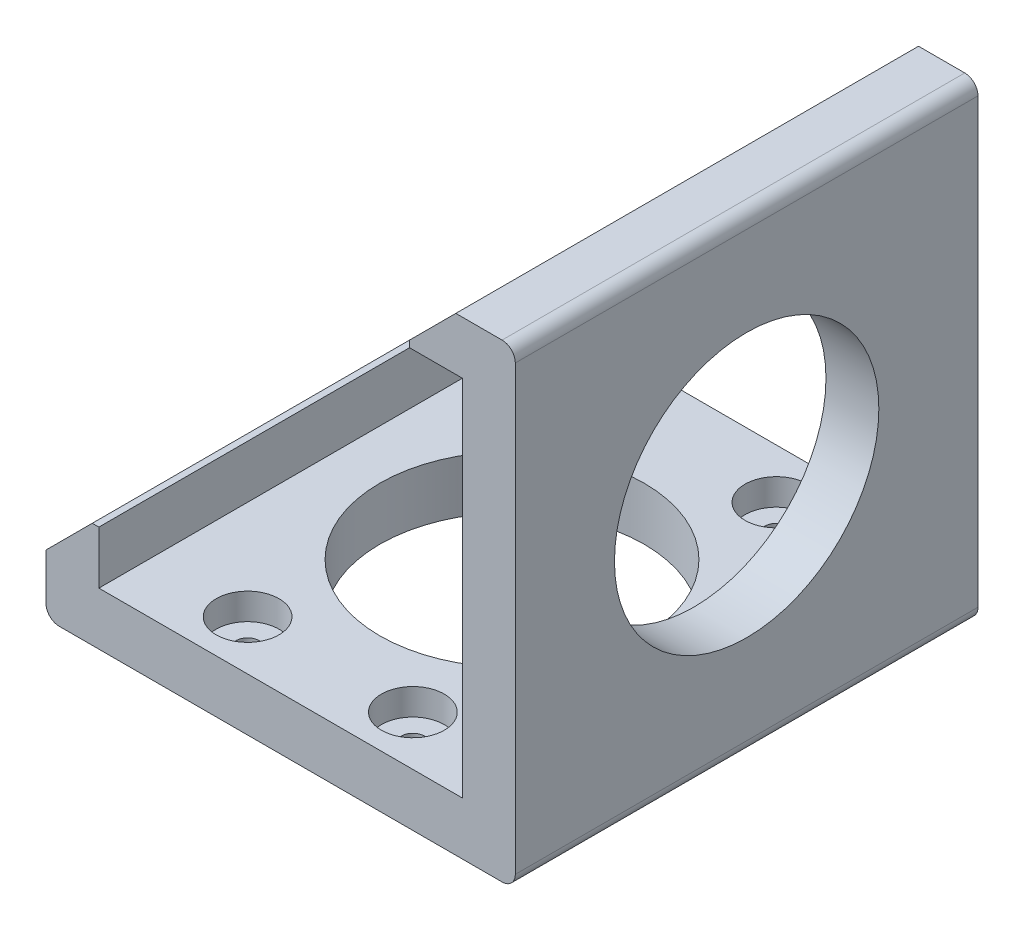
ISO-10303-21;
HEADER;
FILE_DESCRIPTION(('STEP AP214'),'2;1');
FILE_NAME('part.step','',(''),(''),'','','');
FILE_SCHEMA(('AUTOMOTIVE_DESIGN { 1 0 10303 214 1 1 1 1 }'));
ENDSEC;
DATA;
#1=APPLICATION_CONTEXT('core data for automotive mechanical design processes');
#2=APPLICATION_PROTOCOL_DEFINITION('international standard','automotive_design',2000,#1);
#3=PRODUCT_CONTEXT('',#1,'mechanical');
#4=PRODUCT('Part','Part','',(#3));
#5=PRODUCT_RELATED_PRODUCT_CATEGORY('part','',(#4));
#6=PRODUCT_DEFINITION_FORMATION('','',#4);
#7=PRODUCT_DEFINITION_CONTEXT('part definition',#1,'design');
#8=PRODUCT_DEFINITION('design','',#6,#7);
#9=PRODUCT_DEFINITION_SHAPE('','',#8);
#10=(LENGTH_UNIT() NAMED_UNIT(*) SI_UNIT(.MILLI.,.METRE.));
#11=(NAMED_UNIT(*) PLANE_ANGLE_UNIT() SI_UNIT($,.RADIAN.));
#12=(NAMED_UNIT(*) SI_UNIT($,.STERADIAN.) SOLID_ANGLE_UNIT());
#13=UNCERTAINTY_MEASURE_WITH_UNIT(LENGTH_MEASURE(1.E-05),#10,'distance_accuracy_value','');
#14=(GEOMETRIC_REPRESENTATION_CONTEXT(3) GLOBAL_UNCERTAINTY_ASSIGNED_CONTEXT((#13)) GLOBAL_UNIT_ASSIGNED_CONTEXT((#10,
#11,#12)) REPRESENTATION_CONTEXT('',''));
#15=CARTESIAN_POINT('',(0.,0.,0.));
#16=DIRECTION('',(0.,0.,1.));
#17=DIRECTION('',(1.,0.,0.));
#18=AXIS2_PLACEMENT_3D('',#15,#16,#17);
#19=CARTESIAN_POINT('',(-40.,15.,62.5));
#20=DIRECTION('',(0.,-1.,0.));
#21=DIRECTION('',(0.,0.,-1.));
#22=AXIS2_PLACEMENT_3D('',#19,#20,#21);
#23=CYLINDRICAL_SURFACE('',#22,1.75);
#24=CARTESIAN_POINT('',(-40.,-8.,62.5));
#25=DIRECTION('',(0.,-1.,0.));
#26=DIRECTION('',(0.,0.,-1.));
#27=AXIS2_PLACEMENT_3D('',#24,#25,#26);
#28=CIRCLE('',#27,1.75);
#29=CARTESIAN_POINT('',(-40.,-8.,60.75));
#30=VERTEX_POINT('',#29);
#31=EDGE_CURVE('E223',#30,#30,#28,.T.);
#32=ORIENTED_EDGE('',*,*,#31,.T.);
#33=EDGE_LOOP('',(#32));
#34=FACE_BOUND('',#33,.T.);
#35=CARTESIAN_POINT('',(-40.,-4.,62.5));
#36=DIRECTION('',(0.,1.,0.));
#37=DIRECTION('',(0.,0.,1.));
#38=AXIS2_PLACEMENT_3D('',#35,#36,#37);
#39=CIRCLE('',#38,1.75);
#40=CARTESIAN_POINT('',(-40.,-4.,64.25));
#41=VERTEX_POINT('',#40);
#42=EDGE_CURVE('E465',#41,#41,#39,.T.);
#43=ORIENTED_EDGE('',*,*,#42,.T.);
#44=EDGE_LOOP('',(#43));
#45=FACE_BOUND('',#44,.T.);
#46=ADVANCED_FACE('F38',(#34,#45),#23,.F.);
#47=CARTESIAN_POINT('',(-40.,15.,7.50000000000001));
#48=DIRECTION('',(0.,-1.,0.));
#49=DIRECTION('',(0.,0.,-1.));
#50=AXIS2_PLACEMENT_3D('',#47,#48,#49);
#51=CYLINDRICAL_SURFACE('',#50,1.75);
#52=CARTESIAN_POINT('',(-40.,-8.,7.50000000000001));
#53=DIRECTION('',(0.,-1.,0.));
#54=DIRECTION('',(0.,0.,-1.));
#55=AXIS2_PLACEMENT_3D('',#52,#53,#54);
#56=CIRCLE('',#55,1.75);
#57=CARTESIAN_POINT('',(-40.,-8.,5.75000000000001));
#58=VERTEX_POINT('',#57);
#59=EDGE_CURVE('E488',#58,#58,#56,.T.);
#60=ORIENTED_EDGE('',*,*,#59,.T.);
#61=EDGE_LOOP('',(#60));
#62=FACE_BOUND('',#61,.T.);
#63=CARTESIAN_POINT('',(-40.,-4.,7.50000000000001));
#64=DIRECTION('',(0.,1.,0.));
#65=DIRECTION('',(0.,0.,1.));
#66=AXIS2_PLACEMENT_3D('',#63,#64,#65);
#67=CIRCLE('',#66,1.75);
#68=CARTESIAN_POINT('',(-40.,-4.,9.25000000000001));
#69=VERTEX_POINT('',#68);
#70=EDGE_CURVE('E472',#69,#69,#67,.T.);
#71=ORIENTED_EDGE('',*,*,#70,.T.);
#72=EDGE_LOOP('',(#71));
#73=FACE_BOUND('',#72,.T.);
#74=ADVANCED_FACE('F306',(#62,#73),#51,.F.);
#75=CARTESIAN_POINT('',(-15.,15.,7.50000000000001));
#76=DIRECTION('',(0.,-1.,0.));
#77=DIRECTION('',(0.,0.,-1.));
#78=AXIS2_PLACEMENT_3D('',#75,#76,#77);
#79=CYLINDRICAL_SURFACE('',#78,1.75);
#80=CARTESIAN_POINT('',(-15.,-8.,7.50000000000001));
#81=DIRECTION('',(0.,-1.,0.));
#82=DIRECTION('',(0.,0.,-1.));
#83=AXIS2_PLACEMENT_3D('',#80,#81,#82);
#84=CIRCLE('',#83,1.75);
#85=CARTESIAN_POINT('',(-15.,-8.,5.75000000000001));
#86=VERTEX_POINT('',#85);
#87=EDGE_CURVE('E234',#86,#86,#84,.T.);
#88=ORIENTED_EDGE('',*,*,#87,.T.);
#89=EDGE_LOOP('',(#88));
#90=FACE_BOUND('',#89,.T.);
#91=CARTESIAN_POINT('',(-15.,-4.,7.50000000000001));
#92=DIRECTION('',(0.,1.,0.));
#93=DIRECTION('',(0.,0.,1.));
#94=AXIS2_PLACEMENT_3D('',#91,#92,#93);
#95=CIRCLE('',#94,1.75);
#96=CARTESIAN_POINT('',(-15.,-4.,9.25000000000001));
#97=VERTEX_POINT('',#96);
#98=EDGE_CURVE('E462',#97,#97,#95,.T.);
#99=ORIENTED_EDGE('',*,*,#98,.T.);
#100=EDGE_LOOP('',(#99));
#101=FACE_BOUND('',#100,.T.);
#102=ADVANCED_FACE('F311',(#90,#101),#79,.F.);
#103=CARTESIAN_POINT('',(-15.,15.,62.5));
#104=DIRECTION('',(0.,-1.,0.));
#105=DIRECTION('',(0.,0.,-1.));
#106=AXIS2_PLACEMENT_3D('',#103,#104,#105);
#107=CYLINDRICAL_SURFACE('',#106,1.75);
#108=CARTESIAN_POINT('',(-15.,-8.,62.5));
#109=DIRECTION('',(0.,-1.,0.));
#110=DIRECTION('',(0.,0.,-1.));
#111=AXIS2_PLACEMENT_3D('',#108,#109,#110);
#112=CIRCLE('',#111,1.75);
#113=CARTESIAN_POINT('',(-15.,-8.,60.75));
#114=VERTEX_POINT('',#113);
#115=EDGE_CURVE('E229',#114,#114,#112,.T.);
#116=ORIENTED_EDGE('',*,*,#115,.T.);
#117=EDGE_LOOP('',(#116));
#118=FACE_BOUND('',#117,.T.);
#119=CARTESIAN_POINT('',(-15.,-4.,62.5));
#120=DIRECTION('',(0.,1.,0.));
#121=DIRECTION('',(0.,0.,1.));
#122=AXIS2_PLACEMENT_3D('',#119,#120,#121);
#123=CIRCLE('',#122,1.75);
#124=CARTESIAN_POINT('',(-15.,-4.,64.25));
#125=VERTEX_POINT('',#124);
#126=EDGE_CURVE('E458',#125,#125,#123,.T.);
#127=ORIENTED_EDGE('',*,*,#126,.T.);
#128=EDGE_LOOP('',(#127));
#129=FACE_BOUND('',#128,.T.);
#130=ADVANCED_FACE('F392',(#118,#129),#107,.F.);
#131=CARTESIAN_POINT('',(-55.,8.,70.));
#132=DIRECTION('',(-1.,0.,0.));
#133=DIRECTION('',(0.,0.,1.));
#134=AXIS2_PLACEMENT_3D('',#131,#132,#133);
#135=PLANE('',#134);
#136=DIRECTION('',(0.,1.,0.));
#137=VECTOR('',#136,1.);
#138=CARTESIAN_POINT('',(-55.,8.,0.));
#139=LINE('',#138,#137);
#140=CARTESIAN_POINT('',(-55.,0.,0.));
#141=VERTEX_POINT('',#140);
#142=CARTESIAN_POINT('',(-55.,8.,0.));
#143=VERTEX_POINT('',#142);
#144=EDGE_CURVE('E172',#141,#143,#139,.T.);
#145=ORIENTED_EDGE('',*,*,#144,.T.);
#146=DIRECTION('',(0.,0.,-1.));
#147=VECTOR('',#146,1.);
#148=CARTESIAN_POINT('',(-55.,8.,70.));
#149=LINE('',#148,#147);
#150=CARTESIAN_POINT('',(-55.,8.,70.));
#151=VERTEX_POINT('',#150);
#152=EDGE_CURVE('E152',#151,#143,#149,.T.);
#153=ORIENTED_EDGE('',*,*,#152,.F.);
#154=DIRECTION('',(0.,1.,0.));
#155=VECTOR('',#154,1.);
#156=CARTESIAN_POINT('',(-55.,8.,70.));
#157=LINE('',#156,#155);
#158=CARTESIAN_POINT('',(-55.,0.,70.));
#159=VERTEX_POINT('',#158);
#160=EDGE_CURVE('E158',#159,#151,#157,.T.);
#161=ORIENTED_EDGE('',*,*,#160,.F.);
#162=DIRECTION('',(0.,0.,-1.));
#163=VECTOR('',#162,1.);
#164=CARTESIAN_POINT('',(-55.,0.,70.));
#165=LINE('',#164,#163);
#166=EDGE_CURVE('E251',#159,#141,#165,.T.);
#167=ORIENTED_EDGE('',*,*,#166,.T.);
#168=EDGE_LOOP('',(#145,#153,#161,#167));
#169=FACE_BOUND('',#168,.T.);
#170=ADVANCED_FACE('F170',(#169),#135,.F.);
#171=CARTESIAN_POINT('',(-63.,8.,70.));
#172=DIRECTION('',(0.,-1.,0.));
#173=DIRECTION('',(1.,0.,0.));
#174=AXIS2_PLACEMENT_3D('',#171,#172,#173);
#175=PLANE('',#174);
#176=DIRECTION('',(-1.,0.,0.));
#177=VECTOR('',#176,1.);
#178=CARTESIAN_POINT('',(-63.,8.,0.));
#179=LINE('',#178,#177);
#180=CARTESIAN_POINT('',(-56.,8.,0.));
#181=VERTEX_POINT('',#180);
#182=EDGE_CURVE('E226',#143,#181,#179,.T.);
#183=ORIENTED_EDGE('',*,*,#182,.T.);
#184=DIRECTION('',(0.,0.,1.));
#185=VECTOR('',#184,1.);
#186=CARTESIAN_POINT('',(-56.,8.,70.));
#187=LINE('',#186,#185);
#188=CARTESIAN_POINT('',(-56.,8.,70.));
#189=VERTEX_POINT('',#188);
#190=EDGE_CURVE('E155',#181,#189,#187,.T.);
#191=ORIENTED_EDGE('',*,*,#190,.T.);
#192=DIRECTION('',(-1.,0.,0.));
#193=VECTOR('',#192,1.);
#194=CARTESIAN_POINT('',(-63.,8.,70.));
#195=LINE('',#194,#193);
#196=EDGE_CURVE('E147',#151,#189,#195,.T.);
#197=ORIENTED_EDGE('',*,*,#196,.F.);
#198=ORIENTED_EDGE('',*,*,#152,.T.);
#199=EDGE_LOOP('',(#183,#191,#197,#198));
#200=FACE_BOUND('',#199,.T.);
#201=ADVANCED_FACE('F150',(#200),#175,.F.);
#202=CARTESIAN_POINT('',(-63.,8.,70.));
#203=DIRECTION('',(1.,0.,0.));
#204=DIRECTION('',(0.,0.,-1.));
#205=AXIS2_PLACEMENT_3D('',#202,#203,#204);
#206=PLANE('',#205);
#207=DIRECTION('',(0.,-1.,0.));
#208=VECTOR('',#207,1.);
#209=CARTESIAN_POINT('',(-63.,8.,0.));
#210=LINE('',#209,#208);
#211=CARTESIAN_POINT('',(-63.,0.999999999999994,0.));
#212=VERTEX_POINT('',#211);
#213=CARTESIAN_POINT('',(-63.,-6.,0.));
#214=VERTEX_POINT('',#213);
#215=EDGE_CURVE('E254',#212,#214,#210,.T.);
#216=ORIENTED_EDGE('',*,*,#215,.T.);
#217=DIRECTION('',(0.,0.,-1.));
#218=VECTOR('',#217,1.);
#219=CARTESIAN_POINT('',(-63.,-6.,70.));
#220=LINE('',#219,#218);
#221=CARTESIAN_POINT('',(-63.,-6.,70.));
#222=VERTEX_POINT('',#221);
#223=EDGE_CURVE('E11',#214,#222,#220,.F.);
#224=ORIENTED_EDGE('',*,*,#223,.T.);
#225=DIRECTION('',(0.,-1.,0.));
#226=VECTOR('',#225,1.);
#227=CARTESIAN_POINT('',(-63.,8.,70.));
#228=LINE('',#227,#226);
#229=CARTESIAN_POINT('',(-63.,0.999999999999994,70.));
#230=VERTEX_POINT('',#229);
#231=EDGE_CURVE('E157',#230,#222,#228,.T.);
#232=ORIENTED_EDGE('',*,*,#231,.F.);
#233=DIRECTION('',(0.,0.,-1.));
#234=VECTOR('',#233,1.);
#235=CARTESIAN_POINT('',(-63.,0.999999999999994,70.));
#236=LINE('',#235,#234);
#237=EDGE_CURVE('E195',#230,#212,#236,.T.);
#238=ORIENTED_EDGE('',*,*,#237,.T.);
#239=EDGE_LOOP('',(#216,#224,#232,#238));
#240=FACE_BOUND('',#239,.T.);
#241=ADVANCED_FACE('F384',(#240),#206,.F.);
#242=CARTESIAN_POINT('',(-63.,-8.,70.));
#243=DIRECTION('',(0.,1.,0.));
#244=DIRECTION('',(0.,0.,1.));
#245=AXIS2_PLACEMENT_3D('',#242,#243,#244);
#246=PLANE('',#245);
#247=ORIENTED_EDGE('',*,*,#115,.F.);
#248=EDGE_LOOP('',(#247));
#249=FACE_BOUND('',#248,.T.);
#250=ORIENTED_EDGE('',*,*,#87,.F.);
#251=EDGE_LOOP('',(#250));
#252=FACE_BOUND('',#251,.T.);
#253=ORIENTED_EDGE('',*,*,#59,.F.);
#254=EDGE_LOOP('',(#253));
#255=FACE_BOUND('',#254,.T.);
#256=CARTESIAN_POINT('',(-27.5,-8.,35.));
#257=DIRECTION('',(0.,-1.,0.));
#258=DIRECTION('',(0.,0.,-1.));
#259=AXIS2_PLACEMENT_3D('',#256,#257,#258);
#260=CIRCLE('',#259,20.);
#261=CARTESIAN_POINT('',(-27.5,-8.,15.));
#262=VERTEX_POINT('',#261);
#263=EDGE_CURVE('E485',#262,#262,#260,.T.);
#264=ORIENTED_EDGE('',*,*,#263,.F.);
#265=EDGE_LOOP('',(#264));
#266=FACE_BOUND('',#265,.T.);
#267=ORIENTED_EDGE('',*,*,#31,.F.);
#268=EDGE_LOOP('',(#267));
#269=FACE_BOUND('',#268,.T.);
#270=DIRECTION('',(1.,0.,0.));
#271=VECTOR('',#270,1.);
#272=CARTESIAN_POINT('',(-63.,-8.,0.));
#273=LINE('',#272,#271);
#274=CARTESIAN_POINT('',(-61.,-8.,0.));
#275=VERTEX_POINT('',#274);
#276=CARTESIAN_POINT('',(6.00000000000001,-8.,0.));
#277=VERTEX_POINT('',#276);
#278=EDGE_CURVE('E257',#275,#277,#273,.T.);
#279=ORIENTED_EDGE('',*,*,#278,.T.);
#280=DIRECTION('',(0.,0.,-1.));
#281=VECTOR('',#280,1.);
#282=CARTESIAN_POINT('',(6.00000000000001,-8.,70.));
#283=LINE('',#282,#281);
#284=CARTESIAN_POINT('',(6.00000000000001,-8.,70.));
#285=VERTEX_POINT('',#284);
#286=EDGE_CURVE('E47',#277,#285,#283,.F.);
#287=ORIENTED_EDGE('',*,*,#286,.T.);
#288=DIRECTION('',(1.,0.,0.));
#289=VECTOR('',#288,1.);
#290=CARTESIAN_POINT('',(-63.,-8.,70.));
#291=LINE('',#290,#289);
#292=CARTESIAN_POINT('',(-61.,-8.,70.));
#293=VERTEX_POINT('',#292);
#294=EDGE_CURVE('E239',#293,#285,#291,.T.);
#295=ORIENTED_EDGE('',*,*,#294,.F.);
#296=DIRECTION('',(0.,0.,-1.));
#297=VECTOR('',#296,1.);
#298=CARTESIAN_POINT('',(-61.,-8.,70.));
#299=LINE('',#298,#297);
#300=EDGE_CURVE('E218',#293,#275,#299,.T.);
#301=ORIENTED_EDGE('',*,*,#300,.T.);
#302=EDGE_LOOP('',(#279,#287,#295,#301));
#303=FACE_BOUND('',#302,.T.);
#304=ADVANCED_FACE('F380',(#249,#252,#255,#266,#269,#303),#246,.F.);
#305=CARTESIAN_POINT('',(8.,-8.,70.));
#306=DIRECTION('',(-1.,0.,0.));
#307=DIRECTION('',(0.,0.,1.));
#308=AXIS2_PLACEMENT_3D('',#305,#306,#307);
#309=PLANE('',#308);
#310=CARTESIAN_POINT('',(8.,27.5,35.));
#311=DIRECTION('',(1.,0.,0.));
#312=DIRECTION('',(0.,0.,-1.));
#313=AXIS2_PLACEMENT_3D('',#310,#311,#312);
#314=CIRCLE('',#313,20.);
#315=CARTESIAN_POINT('',(8.,27.5,15.));
#316=VERTEX_POINT('',#315);
#317=EDGE_CURVE('E446',#316,#316,#314,.T.);
#318=ORIENTED_EDGE('',*,*,#317,.F.);
#319=EDGE_LOOP('',(#318));
#320=FACE_BOUND('',#319,.T.);
#321=DIRECTION('',(0.,1.,0.));
#322=VECTOR('',#321,1.);
#323=CARTESIAN_POINT('',(8.,-8.,0.));
#324=LINE('',#323,#322);
#325=CARTESIAN_POINT('',(8.,-6.,0.));
#326=VERTEX_POINT('',#325);
#327=CARTESIAN_POINT('',(8.,61.,0.));
#328=VERTEX_POINT('',#327);
#329=EDGE_CURVE('E259',#326,#328,#324,.T.);
#330=ORIENTED_EDGE('',*,*,#329,.T.);
#331=DIRECTION('',(0.,0.,-1.));
#332=VECTOR('',#331,1.);
#333=CARTESIAN_POINT('',(8.,61.,70.));
#334=LINE('',#333,#332);
#335=CARTESIAN_POINT('',(8.,61.,70.));
#336=VERTEX_POINT('',#335);
#337=EDGE_CURVE('E211',#328,#336,#334,.F.);
#338=ORIENTED_EDGE('',*,*,#337,.T.);
#339=DIRECTION('',(0.,1.,0.));
#340=VECTOR('',#339,1.);
#341=CARTESIAN_POINT('',(8.,-8.,70.));
#342=LINE('',#341,#340);
#343=CARTESIAN_POINT('',(8.,-6.,70.));
#344=VERTEX_POINT('',#343);
#345=EDGE_CURVE('E241',#344,#336,#342,.T.);
#346=ORIENTED_EDGE('',*,*,#345,.F.);
#347=DIRECTION('',(0.,0.,-1.));
#348=VECTOR('',#347,1.);
#349=CARTESIAN_POINT('',(8.,-6.,70.));
#350=LINE('',#349,#348);
#351=EDGE_CURVE('E208',#344,#326,#350,.T.);
#352=ORIENTED_EDGE('',*,*,#351,.T.);
#353=EDGE_LOOP('',(#330,#338,#346,#352));
#354=FACE_BOUND('',#353,.T.);
#355=ADVANCED_FACE('F356',(#320,#354),#309,.F.);
#356=CARTESIAN_POINT('',(8.,63.,70.));
#357=DIRECTION('',(0.,-1.,0.));
#358=DIRECTION('',(0.,0.,-1.));
#359=AXIS2_PLACEMENT_3D('',#356,#357,#358);
#360=PLANE('',#359);
#361=DIRECTION('',(-1.,0.,0.));
#362=VECTOR('',#361,1.);
#363=CARTESIAN_POINT('',(8.,63.,70.));
#364=LINE('',#363,#362);
#365=CARTESIAN_POINT('',(6.,63.,70.));
#366=VERTEX_POINT('',#365);
#367=CARTESIAN_POINT('',(-0.999999999999968,63.,70.));
#368=VERTEX_POINT('',#367);
#369=EDGE_CURVE('E243',#366,#368,#364,.T.);
#370=ORIENTED_EDGE('',*,*,#369,.F.);
#371=DIRECTION('',(0.,0.,-1.));
#372=VECTOR('',#371,1.);
#373=CARTESIAN_POINT('',(6.,63.,70.));
#374=LINE('',#373,#372);
#375=CARTESIAN_POINT('',(6.,63.,0.));
#376=VERTEX_POINT('',#375);
#377=EDGE_CURVE('E199',#366,#376,#374,.T.);
#378=ORIENTED_EDGE('',*,*,#377,.T.);
#379=DIRECTION('',(-1.,0.,0.));
#380=VECTOR('',#379,1.);
#381=CARTESIAN_POINT('',(8.,63.,0.));
#382=LINE('',#381,#380);
#383=CARTESIAN_POINT('',(-0.999999999999968,63.,0.));
#384=VERTEX_POINT('',#383);
#385=EDGE_CURVE('E262',#376,#384,#382,.T.);
#386=ORIENTED_EDGE('',*,*,#385,.T.);
#387=DIRECTION('',(0.,0.,1.));
#388=VECTOR('',#387,1.);
#389=CARTESIAN_POINT('',(-0.999999999999968,63.,70.));
#390=LINE('',#389,#388);
#391=EDGE_CURVE('E188',#384,#368,#390,.T.);
#392=ORIENTED_EDGE('',*,*,#391,.T.);
#393=EDGE_LOOP('',(#370,#378,#386,#392));
#394=FACE_BOUND('',#393,.T.);
#395=ADVANCED_FACE('F362',(#394),#360,.F.);
#396=CARTESIAN_POINT('',(-8.,63.,70.));
#397=DIRECTION('',(1.,0.,0.));
#398=DIRECTION('',(0.,1.,0.));
#399=AXIS2_PLACEMENT_3D('',#396,#397,#398);
#400=PLANE('',#399);
#401=DIRECTION('',(0.,-1.,0.));
#402=VECTOR('',#401,1.);
#403=CARTESIAN_POINT('',(-8.,63.,70.));
#404=LINE('',#403,#402);
#405=CARTESIAN_POINT('',(-8.,56.,70.));
#406=VERTEX_POINT('',#405);
#407=CARTESIAN_POINT('',(-8.,55.,70.));
#408=VERTEX_POINT('',#407);
#409=EDGE_CURVE('E245',#406,#408,#404,.T.);
#410=ORIENTED_EDGE('',*,*,#409,.F.);
#411=DIRECTION('',(0.,0.,-1.));
#412=VECTOR('',#411,1.);
#413=CARTESIAN_POINT('',(-8.,56.,70.));
#414=LINE('',#413,#412);
#415=CARTESIAN_POINT('',(-8.,56.,0.));
#416=VERTEX_POINT('',#415);
#417=EDGE_CURVE('E173',#406,#416,#414,.T.);
#418=ORIENTED_EDGE('',*,*,#417,.T.);
#419=DIRECTION('',(0.,-1.,0.));
#420=VECTOR('',#419,1.);
#421=CARTESIAN_POINT('',(-8.,63.,0.));
#422=LINE('',#421,#420);
#423=CARTESIAN_POINT('',(-8.,55.,0.));
#424=VERTEX_POINT('',#423);
#425=EDGE_CURVE('E264',#416,#424,#422,.T.);
#426=ORIENTED_EDGE('',*,*,#425,.T.);
#427=DIRECTION('',(0.,0.,-1.));
#428=VECTOR('',#427,1.);
#429=CARTESIAN_POINT('',(-8.,55.,70.));
#430=LINE('',#429,#428);
#431=EDGE_CURVE('E174',#408,#424,#430,.T.);
#432=ORIENTED_EDGE('',*,*,#431,.F.);
#433=EDGE_LOOP('',(#410,#418,#426,#432));
#434=FACE_BOUND('',#433,.T.);
#435=ADVANCED_FACE('F368',(#434),#400,.F.);
#436=CARTESIAN_POINT('',(0.,55.,70.));
#437=DIRECTION('',(0.,1.,0.));
#438=DIRECTION('',(0.,0.,1.));
#439=AXIS2_PLACEMENT_3D('',#436,#437,#438);
#440=PLANE('',#439);
#441=DIRECTION('',(1.,0.,0.));
#442=VECTOR('',#441,1.);
#443=CARTESIAN_POINT('',(0.,55.,0.));
#444=LINE('',#443,#442);
#445=CARTESIAN_POINT('',(0.,55.,0.));
#446=VERTEX_POINT('',#445);
#447=EDGE_CURVE('E266',#424,#446,#444,.T.);
#448=ORIENTED_EDGE('',*,*,#447,.T.);
#449=DIRECTION('',(0.,0.,-1.));
#450=VECTOR('',#449,1.);
#451=CARTESIAN_POINT('',(0.,55.,70.));
#452=LINE('',#451,#450);
#453=CARTESIAN_POINT('',(0.,55.,70.));
#454=VERTEX_POINT('',#453);
#455=EDGE_CURVE('E180',#454,#446,#452,.T.);
#456=ORIENTED_EDGE('',*,*,#455,.F.);
#457=DIRECTION('',(1.,0.,0.));
#458=VECTOR('',#457,1.);
#459=CARTESIAN_POINT('',(0.,55.,70.));
#460=LINE('',#459,#458);
#461=EDGE_CURVE('E247',#408,#454,#460,.T.);
#462=ORIENTED_EDGE('',*,*,#461,.F.);
#463=ORIENTED_EDGE('',*,*,#431,.T.);
#464=EDGE_LOOP('',(#448,#456,#462,#463));
#465=FACE_BOUND('',#464,.T.);
#466=ADVANCED_FACE('F299',(#465),#440,.F.);
#467=CARTESIAN_POINT('',(0.,0.,70.));
#468=DIRECTION('',(1.,0.,0.));
#469=DIRECTION('',(0.,0.,-1.));
#470=AXIS2_PLACEMENT_3D('',#467,#468,#469);
#471=PLANE('',#470);
#472=CARTESIAN_POINT('',(0.,27.5,35.));
#473=DIRECTION('',(1.,0.,0.));
#474=DIRECTION('',(0.,0.,-1.));
#475=AXIS2_PLACEMENT_3D('',#472,#473,#474);
#476=CIRCLE('',#475,20.);
#477=CARTESIAN_POINT('',(0.,27.5,15.));
#478=VERTEX_POINT('',#477);
#479=EDGE_CURVE('E42',#478,#478,#476,.T.);
#480=ORIENTED_EDGE('',*,*,#479,.T.);
#481=EDGE_LOOP('',(#480));
#482=FACE_BOUND('',#481,.T.);
#483=DIRECTION('',(0.,-1.,0.));
#484=VECTOR('',#483,1.);
#485=CARTESIAN_POINT('',(0.,0.,0.));
#486=LINE('',#485,#484);
#487=CARTESIAN_POINT('',(0.,0.,0.));
#488=VERTEX_POINT('',#487);
#489=EDGE_CURVE('E268',#446,#488,#486,.T.);
#490=ORIENTED_EDGE('',*,*,#489,.T.);
#491=DIRECTION('',(0.,0.,-1.));
#492=VECTOR('',#491,1.);
#493=CARTESIAN_POINT('',(0.,0.,70.));
#494=LINE('',#493,#492);
#495=CARTESIAN_POINT('',(0.,0.,70.));
#496=VERTEX_POINT('',#495);
#497=EDGE_CURVE('E272',#496,#488,#494,.T.);
#498=ORIENTED_EDGE('',*,*,#497,.F.);
#499=DIRECTION('',(0.,-1.,0.));
#500=VECTOR('',#499,1.);
#501=CARTESIAN_POINT('',(0.,0.,70.));
#502=LINE('',#501,#500);
#503=EDGE_CURVE('E249',#454,#496,#502,.T.);
#504=ORIENTED_EDGE('',*,*,#503,.F.);
#505=ORIENTED_EDGE('',*,*,#455,.T.);
#506=EDGE_LOOP('',(#490,#498,#504,#505));
#507=FACE_BOUND('',#506,.T.);
#508=ADVANCED_FACE('F279',(#482,#507),#471,.F.);
#509=CARTESIAN_POINT('',(-55.,0.,70.));
#510=DIRECTION('',(0.,-1.,0.));
#511=DIRECTION('',(0.,0.,-1.));
#512=AXIS2_PLACEMENT_3D('',#509,#510,#511);
#513=PLANE('',#512);
#514=CARTESIAN_POINT('',(-40.,0.,7.50000000000001));
#515=DIRECTION('',(0.,1.,0.));
#516=DIRECTION('',(0.,0.,1.));
#517=AXIS2_PLACEMENT_3D('',#514,#515,#516);
#518=CIRCLE('',#517,4.75);
#519=CARTESIAN_POINT('',(-40.,0.,12.25));
#520=VERTEX_POINT('',#519);
#521=EDGE_CURVE('E451',#520,#520,#518,.T.);
#522=ORIENTED_EDGE('',*,*,#521,.F.);
#523=EDGE_LOOP('',(#522));
#524=FACE_BOUND('',#523,.T.);
#525=CARTESIAN_POINT('',(-15.,0.,7.50000000000001));
#526=DIRECTION('',(0.,1.,0.));
#527=DIRECTION('',(0.,0.,1.));
#528=AXIS2_PLACEMENT_3D('',#525,#526,#527);
#529=CIRCLE('',#528,4.75);
#530=CARTESIAN_POINT('',(-15.,0.,12.25));
#531=VERTEX_POINT('',#530);
#532=EDGE_CURVE('E466',#531,#531,#529,.T.);
#533=ORIENTED_EDGE('',*,*,#532,.F.);
#534=EDGE_LOOP('',(#533));
#535=FACE_BOUND('',#534,.T.);
#536=CARTESIAN_POINT('',(-15.,0.,62.5));
#537=DIRECTION('',(0.,1.,0.));
#538=DIRECTION('',(0.,0.,1.));
#539=AXIS2_PLACEMENT_3D('',#536,#537,#538);
#540=CIRCLE('',#539,4.75);
#541=CARTESIAN_POINT('',(-15.,0.,67.25));
#542=VERTEX_POINT('',#541);
#543=EDGE_CURVE('E455',#542,#542,#540,.T.);
#544=ORIENTED_EDGE('',*,*,#543,.F.);
#545=EDGE_LOOP('',(#544));
#546=FACE_BOUND('',#545,.T.);
#547=CARTESIAN_POINT('',(-40.,0.,62.5));
#548=DIRECTION('',(0.,1.,0.));
#549=DIRECTION('',(0.,0.,1.));
#550=AXIS2_PLACEMENT_3D('',#547,#548,#549);
#551=CIRCLE('',#550,4.75);
#552=CARTESIAN_POINT('',(-40.,0.,67.25));
#553=VERTEX_POINT('',#552);
#554=EDGE_CURVE('E481',#553,#553,#551,.T.);
#555=ORIENTED_EDGE('',*,*,#554,.F.);
#556=EDGE_LOOP('',(#555));
#557=FACE_BOUND('',#556,.T.);
#558=CARTESIAN_POINT('',(-27.5,0.,35.));
#559=DIRECTION('',(0.,-1.,0.));
#560=DIRECTION('',(0.,0.,-1.));
#561=AXIS2_PLACEMENT_3D('',#558,#559,#560);
#562=CIRCLE('',#561,20.);
#563=CARTESIAN_POINT('',(-27.5,0.,15.));
#564=VERTEX_POINT('',#563);
#565=EDGE_CURVE('E221',#564,#564,#562,.T.);
#566=ORIENTED_EDGE('',*,*,#565,.T.);
#567=EDGE_LOOP('',(#566));
#568=FACE_BOUND('',#567,.T.);
#569=DIRECTION('',(-1.,0.,0.));
#570=VECTOR('',#569,1.);
#571=CARTESIAN_POINT('',(-55.,0.,0.));
#572=LINE('',#571,#570);
#573=EDGE_CURVE('E168',#488,#141,#572,.T.);
#574=ORIENTED_EDGE('',*,*,#573,.T.);
#575=ORIENTED_EDGE('',*,*,#166,.F.);
#576=DIRECTION('',(-1.,0.,0.));
#577=VECTOR('',#576,1.);
#578=CARTESIAN_POINT('',(-55.,0.,70.));
#579=LINE('',#578,#577);
#580=EDGE_CURVE('E164',#496,#159,#579,.T.);
#581=ORIENTED_EDGE('',*,*,#580,.F.);
#582=ORIENTED_EDGE('',*,*,#497,.T.);
#583=EDGE_LOOP('',(#574,#575,#581,#582));
#584=FACE_BOUND('',#583,.T.);
#585=ADVANCED_FACE('F290',(#524,#535,#546,#557,#568,#584),#513,.F.);
#586=CARTESIAN_POINT('',(0.,0.,70.));
#587=DIRECTION('',(0.,0.,1.));
#588=DIRECTION('',(1.,0.,0.));
#589=AXIS2_PLACEMENT_3D('',#586,#587,#588);
#590=PLANE('',#589);
#591=ORIENTED_EDGE('',*,*,#345,.T.);
#592=CARTESIAN_POINT('',(6.,61.,70.));
#593=DIRECTION('',(0.,0.,1.));
#594=DIRECTION('',(1.,0.,0.));
#595=AXIS2_PLACEMENT_3D('',#592,#593,#594);
#596=CIRCLE('',#595,2.);
#597=EDGE_CURVE('E216',#336,#366,#596,.T.);
#598=ORIENTED_EDGE('',*,*,#597,.T.);
#599=ORIENTED_EDGE('',*,*,#369,.T.);
#600=DIRECTION('',(0.70710678118655,0.707106781186545,0.));
#601=VECTOR('',#600,1.);
#602=CARTESIAN_POINT('',(-32.,32.0000000000002,70.));
#603=LINE('',#602,#601);
#604=EDGE_CURVE('E193',#368,#406,#603,.F.);
#605=ORIENTED_EDGE('',*,*,#604,.T.);
#606=ORIENTED_EDGE('',*,*,#409,.T.);
#607=ORIENTED_EDGE('',*,*,#461,.T.);
#608=ORIENTED_EDGE('',*,*,#503,.T.);
#609=ORIENTED_EDGE('',*,*,#580,.T.);
#610=ORIENTED_EDGE('',*,*,#160,.T.);
#611=ORIENTED_EDGE('',*,*,#196,.T.);
#612=DIRECTION('',(0.707106781186548,0.707106781186547,0.));
#613=VECTOR('',#612,1.);
#614=CARTESIAN_POINT('',(-32.,32.,70.));
#615=LINE('',#614,#613);
#616=EDGE_CURVE('E191',#189,#230,#615,.F.);
#617=ORIENTED_EDGE('',*,*,#616,.T.);
#618=ORIENTED_EDGE('',*,*,#231,.T.);
#619=CARTESIAN_POINT('',(-61.,-6.,70.));
#620=DIRECTION('',(0.,0.,1.));
#621=DIRECTION('',(1.,0.,0.));
#622=AXIS2_PLACEMENT_3D('',#619,#620,#621);
#623=CIRCLE('',#622,2.);
#624=EDGE_CURVE('E61',#222,#293,#623,.T.);
#625=ORIENTED_EDGE('',*,*,#624,.T.);
#626=ORIENTED_EDGE('',*,*,#294,.T.);
#627=CARTESIAN_POINT('',(6.,-6.,70.));
#628=DIRECTION('',(0.,0.,1.));
#629=DIRECTION('',(1.,0.,0.));
#630=AXIS2_PLACEMENT_3D('',#627,#628,#629);
#631=CIRCLE('',#630,2.);
#632=EDGE_CURVE('E214',#285,#344,#631,.T.);
#633=ORIENTED_EDGE('',*,*,#632,.T.);
#634=EDGE_LOOP('',(#591,#598,#599,#605,#606,#607,#608,#609,#610,#611,#617,#618,#625,#626,#633));
#635=FACE_BOUND('',#634,.T.);
#636=ADVANCED_FACE('F162',(#635),#590,.T.);
#637=CARTESIAN_POINT('',(0.,0.,0.));
#638=DIRECTION('',(0.,0.,1.));
#639=DIRECTION('',(1.,0.,0.));
#640=AXIS2_PLACEMENT_3D('',#637,#638,#639);
#641=PLANE('',#640);
#642=ORIENTED_EDGE('',*,*,#385,.F.);
#643=CARTESIAN_POINT('',(6.,61.,0.));
#644=DIRECTION('',(0.,0.,1.));
#645=DIRECTION('',(1.,0.,0.));
#646=AXIS2_PLACEMENT_3D('',#643,#644,#645);
#647=CIRCLE('',#646,2.);
#648=EDGE_CURVE('E206',#376,#328,#647,.F.);
#649=ORIENTED_EDGE('',*,*,#648,.T.);
#650=ORIENTED_EDGE('',*,*,#329,.F.);
#651=CARTESIAN_POINT('',(6.,-6.,0.));
#652=DIRECTION('',(0.,0.,1.));
#653=DIRECTION('',(1.,0.,0.));
#654=AXIS2_PLACEMENT_3D('',#651,#652,#653);
#655=CIRCLE('',#654,2.);
#656=EDGE_CURVE('E204',#326,#277,#655,.F.);
#657=ORIENTED_EDGE('',*,*,#656,.T.);
#658=ORIENTED_EDGE('',*,*,#278,.F.);
#659=CARTESIAN_POINT('',(-61.,-6.,0.));
#660=DIRECTION('',(0.,0.,1.));
#661=DIRECTION('',(1.,0.,0.));
#662=AXIS2_PLACEMENT_3D('',#659,#660,#661);
#663=CIRCLE('',#662,2.);
#664=EDGE_CURVE('E202',#275,#214,#663,.F.);
#665=ORIENTED_EDGE('',*,*,#664,.T.);
#666=ORIENTED_EDGE('',*,*,#215,.F.);
#667=DIRECTION('',(-0.707106781186548,-0.707106781186547,0.));
#668=VECTOR('',#667,1.);
#669=CARTESIAN_POINT('',(-63.,0.999999999999994,0.));
#670=LINE('',#669,#668);
#671=EDGE_CURVE('E177',#212,#181,#670,.F.);
#672=ORIENTED_EDGE('',*,*,#671,.T.);
#673=ORIENTED_EDGE('',*,*,#182,.F.);
#674=ORIENTED_EDGE('',*,*,#144,.F.);
#675=ORIENTED_EDGE('',*,*,#573,.F.);
#676=ORIENTED_EDGE('',*,*,#489,.F.);
#677=ORIENTED_EDGE('',*,*,#447,.F.);
#678=ORIENTED_EDGE('',*,*,#425,.F.);
#679=DIRECTION('',(-0.70710678118655,-0.707106781186545,0.));
#680=VECTOR('',#679,1.);
#681=CARTESIAN_POINT('',(-8.,56.,0.));
#682=LINE('',#681,#680);
#683=EDGE_CURVE('E185',#416,#384,#682,.F.);
#684=ORIENTED_EDGE('',*,*,#683,.T.);
#685=EDGE_LOOP('',(#642,#649,#650,#657,#658,#665,#666,#672,#673,#674,#675,#676,#677,#678,#684));
#686=FACE_BOUND('',#685,.T.);
#687=ADVANCED_FACE('F287',(#686),#641,.F.);
#688=CARTESIAN_POINT('',(-8.,56.,70.));
#689=DIRECTION('',(0.707106781186545,-0.70710678118655,0.));
#690=DIRECTION('',(0.,0.,-1.));
#691=AXIS2_PLACEMENT_3D('',#688,#689,#690);
#692=PLANE('',#691);
#693=ORIENTED_EDGE('',*,*,#604,.F.);
#694=ORIENTED_EDGE('',*,*,#391,.F.);
#695=ORIENTED_EDGE('',*,*,#683,.F.);
#696=ORIENTED_EDGE('',*,*,#417,.F.);
#697=EDGE_LOOP('',(#693,#694,#695,#696));
#698=FACE_BOUND('',#697,.T.);
#699=ADVANCED_FACE('F318',(#698),#692,.F.);
#700=CARTESIAN_POINT('',(-63.,0.999999999999994,70.));
#701=DIRECTION('',(0.707106781186547,-0.707106781186548,0.));
#702=DIRECTION('',(0.,0.,-1.));
#703=AXIS2_PLACEMENT_3D('',#700,#701,#702);
#704=PLANE('',#703);
#705=ORIENTED_EDGE('',*,*,#616,.F.);
#706=ORIENTED_EDGE('',*,*,#190,.F.);
#707=ORIENTED_EDGE('',*,*,#671,.F.);
#708=ORIENTED_EDGE('',*,*,#237,.F.);
#709=EDGE_LOOP('',(#705,#706,#707,#708));
#710=FACE_BOUND('',#709,.T.);
#711=ADVANCED_FACE('F322',(#710),#704,.F.);
#712=CARTESIAN_POINT('',(6.,61.,70.));
#713=DIRECTION('',(0.,0.,-1.));
#714=DIRECTION('',(-1.,0.,0.));
#715=AXIS2_PLACEMENT_3D('',#712,#713,#714);
#716=CYLINDRICAL_SURFACE('',#715,2.);
#717=ORIENTED_EDGE('',*,*,#597,.F.);
#718=ORIENTED_EDGE('',*,*,#337,.F.);
#719=ORIENTED_EDGE('',*,*,#648,.F.);
#720=ORIENTED_EDGE('',*,*,#377,.F.);
#721=EDGE_LOOP('',(#717,#718,#719,#720));
#722=FACE_BOUND('',#721,.T.);
#723=ADVANCED_FACE('F328',(#722),#716,.T.);
#724=CARTESIAN_POINT('',(6.,-6.,70.));
#725=DIRECTION('',(0.,0.,-1.));
#726=DIRECTION('',(-1.,0.,0.));
#727=AXIS2_PLACEMENT_3D('',#724,#725,#726);
#728=CYLINDRICAL_SURFACE('',#727,2.);
#729=ORIENTED_EDGE('',*,*,#632,.F.);
#730=ORIENTED_EDGE('',*,*,#286,.F.);
#731=ORIENTED_EDGE('',*,*,#656,.F.);
#732=ORIENTED_EDGE('',*,*,#351,.F.);
#733=EDGE_LOOP('',(#729,#730,#731,#732));
#734=FACE_BOUND('',#733,.T.);
#735=ADVANCED_FACE('F342',(#734),#728,.T.);
#736=CARTESIAN_POINT('',(-61.,-6.,70.));
#737=DIRECTION('',(0.,0.,-1.));
#738=DIRECTION('',(-1.,0.,0.));
#739=AXIS2_PLACEMENT_3D('',#736,#737,#738);
#740=CYLINDRICAL_SURFACE('',#739,2.);
#741=ORIENTED_EDGE('',*,*,#624,.F.);
#742=ORIENTED_EDGE('',*,*,#223,.F.);
#743=ORIENTED_EDGE('',*,*,#664,.F.);
#744=ORIENTED_EDGE('',*,*,#300,.F.);
#745=EDGE_LOOP('',(#741,#742,#743,#744));
#746=FACE_BOUND('',#745,.T.);
#747=ADVANCED_FACE('F40',(#746),#740,.T.);
#748=CARTESIAN_POINT('',(-27.5,15.,35.));
#749=DIRECTION('',(0.,-1.,0.));
#750=DIRECTION('',(0.,0.,-1.));
#751=AXIS2_PLACEMENT_3D('',#748,#749,#750);
#752=CYLINDRICAL_SURFACE('',#751,20.);
#753=ORIENTED_EDGE('',*,*,#263,.T.);
#754=EDGE_LOOP('',(#753));
#755=FACE_BOUND('',#754,.T.);
#756=ORIENTED_EDGE('',*,*,#565,.F.);
#757=EDGE_LOOP('',(#756));
#758=FACE_BOUND('',#757,.T.);
#759=ADVANCED_FACE('F349',(#755,#758),#752,.F.);
#760=CARTESIAN_POINT('',(-15.,-4.,62.5));
#761=DIRECTION('',(0.,1.,0.));
#762=DIRECTION('',(0.,0.,1.));
#763=AXIS2_PLACEMENT_3D('',#760,#761,#762);
#764=CYLINDRICAL_SURFACE('',#763,4.75);
#765=CARTESIAN_POINT('',(-15.,-4.,62.5));
#766=DIRECTION('',(0.,1.,0.));
#767=DIRECTION('',(0.,0.,1.));
#768=AXIS2_PLACEMENT_3D('',#765,#766,#767);
#769=CIRCLE('',#768,4.75);
#770=CARTESIAN_POINT('',(-15.,-4.,67.25));
#771=VERTEX_POINT('',#770);
#772=EDGE_CURVE('E459',#771,#771,#769,.T.);
#773=ORIENTED_EDGE('',*,*,#772,.F.);
#774=EDGE_LOOP('',(#773));
#775=FACE_BOUND('',#774,.T.);
#776=ORIENTED_EDGE('',*,*,#543,.T.);
#777=EDGE_LOOP('',(#776));
#778=FACE_BOUND('',#777,.T.);
#779=ADVANCED_FACE('F404',(#775,#778),#764,.F.);
#780=CARTESIAN_POINT('',(-15.,-4.,62.5));
#781=DIRECTION('',(0.,1.,0.));
#782=DIRECTION('',(0.,0.,1.));
#783=AXIS2_PLACEMENT_3D('',#780,#781,#782);
#784=PLANE('',#783);
#785=ORIENTED_EDGE('',*,*,#126,.F.);
#786=EDGE_LOOP('',(#785));
#787=FACE_BOUND('',#786,.T.);
#788=ORIENTED_EDGE('',*,*,#772,.T.);
#789=EDGE_LOOP('',(#788));
#790=FACE_BOUND('',#789,.T.);
#791=ADVANCED_FACE('F431',(#787,#790),#784,.T.);
#792=CARTESIAN_POINT('',(-15.,-4.,7.50000000000001));
#793=DIRECTION('',(0.,1.,0.));
#794=DIRECTION('',(0.,0.,1.));
#795=AXIS2_PLACEMENT_3D('',#792,#793,#794);
#796=CYLINDRICAL_SURFACE('',#795,4.75);
#797=CARTESIAN_POINT('',(-15.,-4.,7.50000000000001));
#798=DIRECTION('',(0.,1.,0.));
#799=DIRECTION('',(0.,0.,1.));
#800=AXIS2_PLACEMENT_3D('',#797,#798,#799);
#801=CIRCLE('',#800,4.75);
#802=CARTESIAN_POINT('',(-15.,-4.,12.25));
#803=VERTEX_POINT('',#802);
#804=EDGE_CURVE('E469',#803,#803,#801,.T.);
#805=ORIENTED_EDGE('',*,*,#804,.F.);
#806=EDGE_LOOP('',(#805));
#807=FACE_BOUND('',#806,.T.);
#808=ORIENTED_EDGE('',*,*,#532,.T.);
#809=EDGE_LOOP('',(#808));
#810=FACE_BOUND('',#809,.T.);
#811=ADVANCED_FACE('F427',(#807,#810),#796,.F.);
#812=CARTESIAN_POINT('',(-15.,-4.,7.50000000000001));
#813=DIRECTION('',(0.,1.,0.));
#814=DIRECTION('',(0.,0.,1.));
#815=AXIS2_PLACEMENT_3D('',#812,#813,#814);
#816=PLANE('',#815);
#817=ORIENTED_EDGE('',*,*,#98,.F.);
#818=EDGE_LOOP('',(#817));
#819=FACE_BOUND('',#818,.T.);
#820=ORIENTED_EDGE('',*,*,#804,.T.);
#821=EDGE_LOOP('',(#820));
#822=FACE_BOUND('',#821,.T.);
#823=ADVANCED_FACE('F423',(#819,#822),#816,.T.);
#824=CARTESIAN_POINT('',(-40.,-4.,7.50000000000001));
#825=DIRECTION('',(0.,1.,0.));
#826=DIRECTION('',(0.,0.,1.));
#827=AXIS2_PLACEMENT_3D('',#824,#825,#826);
#828=CYLINDRICAL_SURFACE('',#827,4.75);
#829=CARTESIAN_POINT('',(-40.,-4.,7.50000000000001));
#830=DIRECTION('',(0.,1.,0.));
#831=DIRECTION('',(0.,0.,1.));
#832=AXIS2_PLACEMENT_3D('',#829,#830,#831);
#833=CIRCLE('',#832,4.75);
#834=CARTESIAN_POINT('',(-40.,-4.,12.25));
#835=VERTEX_POINT('',#834);
#836=EDGE_CURVE('E449',#835,#835,#833,.T.);
#837=ORIENTED_EDGE('',*,*,#836,.F.);
#838=EDGE_LOOP('',(#837));
#839=FACE_BOUND('',#838,.T.);
#840=ORIENTED_EDGE('',*,*,#521,.T.);
#841=EDGE_LOOP('',(#840));
#842=FACE_BOUND('',#841,.T.);
#843=ADVANCED_FACE('F419',(#839,#842),#828,.F.);
#844=CARTESIAN_POINT('',(-40.,-4.,7.50000000000001));
#845=DIRECTION('',(0.,1.,0.));
#846=DIRECTION('',(0.,0.,1.));
#847=AXIS2_PLACEMENT_3D('',#844,#845,#846);
#848=PLANE('',#847);
#849=ORIENTED_EDGE('',*,*,#70,.F.);
#850=EDGE_LOOP('',(#849));
#851=FACE_BOUND('',#850,.T.);
#852=ORIENTED_EDGE('',*,*,#836,.T.);
#853=EDGE_LOOP('',(#852));
#854=FACE_BOUND('',#853,.T.);
#855=ADVANCED_FACE('F411',(#851,#854),#848,.T.);
#856=CARTESIAN_POINT('',(-40.,-4.,62.5));
#857=DIRECTION('',(0.,1.,0.));
#858=DIRECTION('',(0.,0.,1.));
#859=AXIS2_PLACEMENT_3D('',#856,#857,#858);
#860=CYLINDRICAL_SURFACE('',#859,4.75);
#861=CARTESIAN_POINT('',(-40.,-4.,62.5));
#862=DIRECTION('',(0.,1.,0.));
#863=DIRECTION('',(0.,0.,1.));
#864=AXIS2_PLACEMENT_3D('',#861,#862,#863);
#865=CIRCLE('',#864,4.75);
#866=CARTESIAN_POINT('',(-40.,-4.,67.25));
#867=VERTEX_POINT('',#866);
#868=EDGE_CURVE('E482',#867,#867,#865,.T.);
#869=ORIENTED_EDGE('',*,*,#868,.F.);
#870=EDGE_LOOP('',(#869));
#871=FACE_BOUND('',#870,.T.);
#872=ORIENTED_EDGE('',*,*,#554,.T.);
#873=EDGE_LOOP('',(#872));
#874=FACE_BOUND('',#873,.T.);
#875=ADVANCED_FACE('F407',(#871,#874),#860,.F.);
#876=CARTESIAN_POINT('',(-40.,-4.,62.5));
#877=DIRECTION('',(0.,1.,0.));
#878=DIRECTION('',(0.,0.,1.));
#879=AXIS2_PLACEMENT_3D('',#876,#877,#878);
#880=PLANE('',#879);
#881=ORIENTED_EDGE('',*,*,#42,.F.);
#882=EDGE_LOOP('',(#881));
#883=FACE_BOUND('',#882,.T.);
#884=ORIENTED_EDGE('',*,*,#868,.T.);
#885=EDGE_LOOP('',(#884));
#886=FACE_BOUND('',#885,.T.);
#887=ADVANCED_FACE('F410',(#883,#886),#880,.T.);
#888=CARTESIAN_POINT('',(-15.,27.5,35.));
#889=DIRECTION('',(1.,0.,0.));
#890=DIRECTION('',(0.,0.,-1.));
#891=AXIS2_PLACEMENT_3D('',#888,#889,#890);
#892=CYLINDRICAL_SURFACE('',#891,20.);
#893=ORIENTED_EDGE('',*,*,#317,.T.);
#894=EDGE_LOOP('',(#893));
#895=FACE_BOUND('',#894,.T.);
#896=ORIENTED_EDGE('',*,*,#479,.F.);
#897=EDGE_LOOP('',(#896));
#898=FACE_BOUND('',#897,.T.);
#899=ADVANCED_FACE('F415',(#895,#898),#892,.F.);
#900=CLOSED_SHELL('',(#46,#74,#102,#130,#170,#201,#241,#304,#355,#395,#435,#466,#508,#585,#636,
#687,#699,#711,#723,#735,#747,#759,#779,#791,#811,#823,#843,#855,#875,#887,#899));
#901=MANIFOLD_SOLID_BREP('B2',#900);
#902=ADVANCED_BREP_SHAPE_REPRESENTATION('',(#18,#901),#14);
#903=SHAPE_DEFINITION_REPRESENTATION(#9,#902);
ENDSEC;
END-ISO-10303-21;
